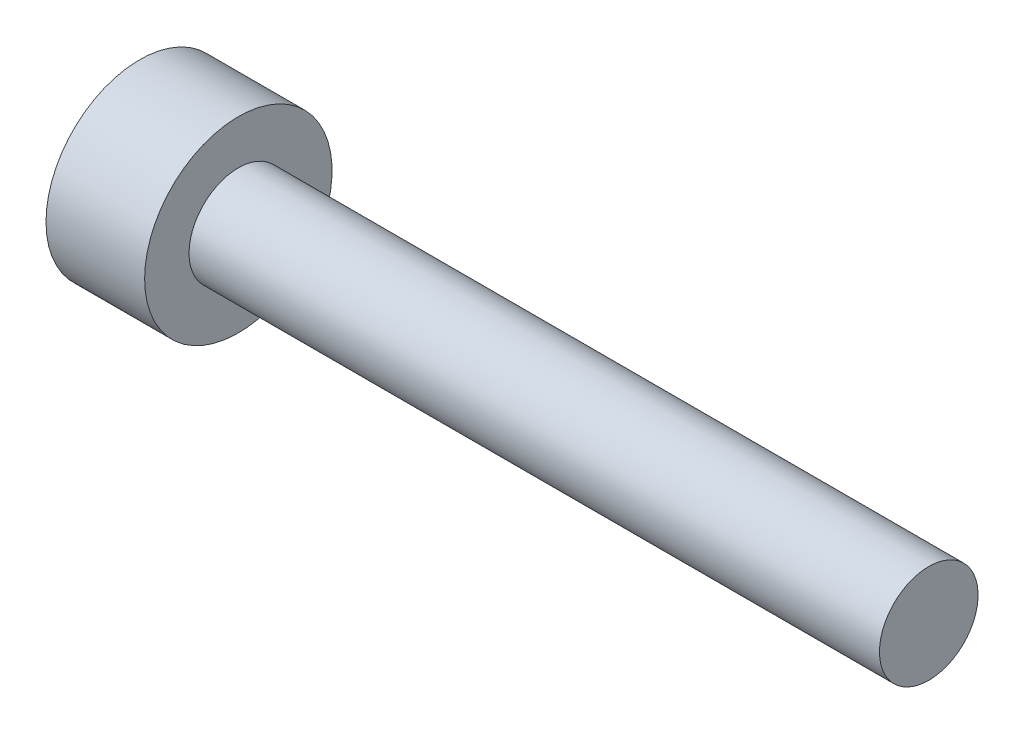
ISO-10303-21;
HEADER;
FILE_DESCRIPTION(('STEP AP214'),'2;1');
FILE_NAME('part.step','',(''),(''),'','','');
FILE_SCHEMA(('AUTOMOTIVE_DESIGN { 1 0 10303 214 1 1 1 1 }'));
ENDSEC;
DATA;
#1=APPLICATION_CONTEXT('core data for automotive mechanical design processes');
#2=APPLICATION_PROTOCOL_DEFINITION('international standard','automotive_design',2000,#1);
#3=PRODUCT_CONTEXT('',#1,'mechanical');
#4=PRODUCT('Part','Part','',(#3));
#5=PRODUCT_RELATED_PRODUCT_CATEGORY('part','',(#4));
#6=PRODUCT_DEFINITION_FORMATION('','',#4);
#7=PRODUCT_DEFINITION_CONTEXT('part definition',#1,'design');
#8=PRODUCT_DEFINITION('design','',#6,#7);
#9=PRODUCT_DEFINITION_SHAPE('','',#8);
#10=(LENGTH_UNIT() NAMED_UNIT(*) SI_UNIT(.MILLI.,.METRE.));
#11=(NAMED_UNIT(*) PLANE_ANGLE_UNIT() SI_UNIT($,.RADIAN.));
#12=(NAMED_UNIT(*) SI_UNIT($,.STERADIAN.) SOLID_ANGLE_UNIT());
#13=UNCERTAINTY_MEASURE_WITH_UNIT(LENGTH_MEASURE(1.E-05),#10,'distance_accuracy_value','');
#14=(GEOMETRIC_REPRESENTATION_CONTEXT(3) GLOBAL_UNCERTAINTY_ASSIGNED_CONTEXT((#13)) GLOBAL_UNIT_ASSIGNED_CONTEXT((#10,
#11,#12)) REPRESENTATION_CONTEXT('',''));
#15=CARTESIAN_POINT('',(0.,0.,0.));
#16=DIRECTION('',(0.,0.,1.));
#17=DIRECTION('',(1.,0.,0.));
#18=AXIS2_PLACEMENT_3D('',#15,#16,#17);
#19=CARTESIAN_POINT('',(-2.,0.,0.));
#20=DIRECTION('',(1.,0.,0.));
#21=DIRECTION('',(0.,0.,-1.));
#22=AXIS2_PLACEMENT_3D('',#19,#20,#21);
#23=PLANE('',#22);
#24=CARTESIAN_POINT('',(-2.,0.,0.));
#25=DIRECTION('',(-1.,0.,0.));
#26=DIRECTION('',(0.,0.,1.));
#27=AXIS2_PLACEMENT_3D('',#24,#25,#26);
#28=CIRCLE('',#27,1.9);
#29=CARTESIAN_POINT('',(-2.,0.,1.9));
#30=VERTEX_POINT('',#29);
#31=EDGE_CURVE('E11',#30,#30,#28,.T.);
#32=ORIENTED_EDGE('',*,*,#31,.T.);
#33=EDGE_LOOP('',(#32));
#34=FACE_BOUND('',#33,.T.);
#35=DIRECTION('',(0.,0.866025403784439,-0.5));
#36=VECTOR('',#35,1.);
#37=CARTESIAN_POINT('',(-2.,-0.75,-0.433012701892219));
#38=LINE('',#37,#36);
#39=CARTESIAN_POINT('',(-2.,-0.75,-0.433012701892219));
#40=VERTEX_POINT('',#39);
#41=CARTESIAN_POINT('',(-2.,0.,-0.866025403784439));
#42=VERTEX_POINT('',#41);
#43=EDGE_CURVE('E54',#40,#42,#38,.T.);
#44=ORIENTED_EDGE('',*,*,#43,.T.);
#45=DIRECTION('',(0.,0.866025403784439,0.5));
#46=VECTOR('',#45,1.);
#47=CARTESIAN_POINT('',(-2.,0.,-0.866025403784439));
#48=LINE('',#47,#46);
#49=CARTESIAN_POINT('',(-2.,0.75,-0.433012701892219));
#50=VERTEX_POINT('',#49);
#51=EDGE_CURVE('E127',#42,#50,#48,.T.);
#52=ORIENTED_EDGE('',*,*,#51,.T.);
#53=DIRECTION('',(0.,0.,1.));
#54=VECTOR('',#53,1.);
#55=CARTESIAN_POINT('',(-2.,0.75,-0.433012701892219));
#56=LINE('',#55,#54);
#57=CARTESIAN_POINT('',(-2.,0.75,0.433012701892219));
#58=VERTEX_POINT('',#57);
#59=EDGE_CURVE('E129',#50,#58,#56,.T.);
#60=ORIENTED_EDGE('',*,*,#59,.T.);
#61=DIRECTION('',(0.,-0.866025403784438,0.5));
#62=VECTOR('',#61,1.);
#63=CARTESIAN_POINT('',(-2.,0.75,0.433012701892219));
#64=LINE('',#63,#62);
#65=CARTESIAN_POINT('',(-2.,0.,0.866025403784439));
#66=VERTEX_POINT('',#65);
#67=EDGE_CURVE('E135',#58,#66,#64,.T.);
#68=ORIENTED_EDGE('',*,*,#67,.T.);
#69=DIRECTION('',(0.,-0.866025403784439,-0.5));
#70=VECTOR('',#69,1.);
#71=CARTESIAN_POINT('',(-2.,0.,0.866025403784439));
#72=LINE('',#71,#70);
#73=CARTESIAN_POINT('',(-2.,-0.75,0.43301270189222));
#74=VERTEX_POINT('',#73);
#75=EDGE_CURVE('E116',#66,#74,#72,.T.);
#76=ORIENTED_EDGE('',*,*,#75,.T.);
#77=DIRECTION('',(0.,0.,-1.));
#78=VECTOR('',#77,1.);
#79=CARTESIAN_POINT('',(-2.,-0.75,0.43301270189222));
#80=LINE('',#79,#78);
#81=EDGE_CURVE('E134',#74,#40,#80,.T.);
#82=ORIENTED_EDGE('',*,*,#81,.T.);
#83=EDGE_LOOP('',(#44,#52,#60,#68,#76,#82));
#84=FACE_BOUND('',#83,.T.);
#85=ADVANCED_FACE('F41',(#34,#84),#23,.F.);
#86=CARTESIAN_POINT('',(-1000.,0.,0.));
#87=DIRECTION('',(-1.,0.,0.));
#88=DIRECTION('',(0.,0.,1.));
#89=AXIS2_PLACEMENT_3D('',#86,#87,#88);
#90=CYLINDRICAL_SURFACE('',#89,1.9);
#91=ORIENTED_EDGE('',*,*,#31,.F.);
#92=EDGE_LOOP('',(#91));
#93=FACE_BOUND('',#92,.T.);
#94=CARTESIAN_POINT('',(0.,0.,0.));
#95=DIRECTION('',(-1.,0.,0.));
#96=DIRECTION('',(0.,0.,1.));
#97=AXIS2_PLACEMENT_3D('',#94,#95,#96);
#98=CIRCLE('',#97,1.9);
#99=CARTESIAN_POINT('',(0.,0.,1.9));
#100=VERTEX_POINT('',#99);
#101=EDGE_CURVE('E48',#100,#100,#98,.T.);
#102=ORIENTED_EDGE('',*,*,#101,.T.);
#103=EDGE_LOOP('',(#102));
#104=FACE_BOUND('',#103,.T.);
#105=ADVANCED_FACE('F152',(#93,#104),#90,.T.);
#106=CARTESIAN_POINT('',(0.,1.9,0.));
#107=DIRECTION('',(-1.,0.,0.));
#108=DIRECTION('',(0.,0.,1.));
#109=AXIS2_PLACEMENT_3D('',#106,#107,#108);
#110=PLANE('',#109);
#111=ORIENTED_EDGE('',*,*,#101,.F.);
#112=EDGE_LOOP('',(#111));
#113=FACE_BOUND('',#112,.T.);
#114=CARTESIAN_POINT('',(0.,0.,0.));
#115=DIRECTION('',(-1.,0.,0.));
#116=DIRECTION('',(0.,0.,1.));
#117=AXIS2_PLACEMENT_3D('',#114,#115,#116);
#118=CIRCLE('',#117,1.);
#119=CARTESIAN_POINT('',(0.,0.,1.));
#120=VERTEX_POINT('',#119);
#121=EDGE_CURVE('E149',#120,#120,#118,.T.);
#122=ORIENTED_EDGE('',*,*,#121,.T.);
#123=EDGE_LOOP('',(#122));
#124=FACE_BOUND('',#123,.T.);
#125=ADVANCED_FACE('F156',(#113,#124),#110,.F.);
#126=CARTESIAN_POINT('',(-1000.,0.,0.));
#127=DIRECTION('',(-1.,0.,0.));
#128=DIRECTION('',(0.,0.,1.));
#129=AXIS2_PLACEMENT_3D('',#126,#127,#128);
#130=CYLINDRICAL_SURFACE('',#129,1.);
#131=ORIENTED_EDGE('',*,*,#121,.F.);
#132=EDGE_LOOP('',(#131));
#133=FACE_BOUND('',#132,.T.);
#134=CARTESIAN_POINT('',(14.,0.,0.));
#135=DIRECTION('',(-1.,0.,0.));
#136=DIRECTION('',(0.,0.,1.));
#137=AXIS2_PLACEMENT_3D('',#134,#135,#136);
#138=CIRCLE('',#137,1.);
#139=CARTESIAN_POINT('',(14.,0.,1.));
#140=VERTEX_POINT('',#139);
#141=EDGE_CURVE('E148',#140,#140,#138,.T.);
#142=ORIENTED_EDGE('',*,*,#141,.T.);
#143=EDGE_LOOP('',(#142));
#144=FACE_BOUND('',#143,.T.);
#145=ADVANCED_FACE('F157',(#133,#144),#130,.T.);
#146=CARTESIAN_POINT('',(14.,1.,0.));
#147=DIRECTION('',(-1.,0.,0.));
#148=DIRECTION('',(0.,0.,1.));
#149=AXIS2_PLACEMENT_3D('',#146,#147,#148);
#150=PLANE('',#149);
#151=ORIENTED_EDGE('',*,*,#141,.F.);
#152=EDGE_LOOP('',(#151));
#153=FACE_BOUND('',#152,.T.);
#154=ADVANCED_FACE('F164',(#153),#150,.F.);
#155=CARTESIAN_POINT('',(-1.,-0.75,-0.433012701892219));
#156=DIRECTION('',(0.,0.5,0.866025403784439));
#157=DIRECTION('',(0.,-0.866025403784439,0.5));
#158=AXIS2_PLACEMENT_3D('',#155,#156,#157);
#159=PLANE('',#158);
#160=ORIENTED_EDGE('',*,*,#43,.F.);
#161=DIRECTION('',(-1.,0.,0.));
#162=VECTOR('',#161,1.);
#163=CARTESIAN_POINT('',(-1.,-0.75,-0.433012701892219));
#164=LINE('',#163,#162);
#165=CARTESIAN_POINT('',(-1.,-0.75,-0.433012701892219));
#166=VERTEX_POINT('',#165);
#167=EDGE_CURVE('E121',#166,#40,#164,.T.);
#168=ORIENTED_EDGE('',*,*,#167,.F.);
#169=DIRECTION('',(0.,0.866025403784439,-0.5));
#170=VECTOR('',#169,1.);
#171=CARTESIAN_POINT('',(-1.,-0.75,-0.433012701892219));
#172=LINE('',#171,#170);
#173=CARTESIAN_POINT('',(-1.,0.,-0.866025403784439));
#174=VERTEX_POINT('',#173);
#175=EDGE_CURVE('E137',#166,#174,#172,.T.);
#176=ORIENTED_EDGE('',*,*,#175,.T.);
#177=DIRECTION('',(-1.,0.,0.));
#178=VECTOR('',#177,1.);
#179=CARTESIAN_POINT('',(-1.,0.,-0.866025403784439));
#180=LINE('',#179,#178);
#181=EDGE_CURVE('E145',#174,#42,#180,.T.);
#182=ORIENTED_EDGE('',*,*,#181,.T.);
#183=EDGE_LOOP('',(#160,#168,#176,#182));
#184=FACE_BOUND('',#183,.T.);
#185=ADVANCED_FACE('F168',(#184),#159,.T.);
#186=CARTESIAN_POINT('',(-1.,0.,-0.866025403784439));
#187=DIRECTION('',(0.,-0.5,0.866025403784439));
#188=DIRECTION('',(0.,-0.866025403784439,-0.5));
#189=AXIS2_PLACEMENT_3D('',#186,#187,#188);
#190=PLANE('',#189);
#191=ORIENTED_EDGE('',*,*,#51,.F.);
#192=ORIENTED_EDGE('',*,*,#181,.F.);
#193=DIRECTION('',(0.,0.866025403784439,0.5));
#194=VECTOR('',#193,1.);
#195=CARTESIAN_POINT('',(-1.,0.,-0.866025403784439));
#196=LINE('',#195,#194);
#197=CARTESIAN_POINT('',(-1.,0.75,-0.433012701892219));
#198=VERTEX_POINT('',#197);
#199=EDGE_CURVE('E94',#174,#198,#196,.T.);
#200=ORIENTED_EDGE('',*,*,#199,.T.);
#201=DIRECTION('',(-1.,0.,0.));
#202=VECTOR('',#201,1.);
#203=CARTESIAN_POINT('',(-1.,0.75,-0.433012701892219));
#204=LINE('',#203,#202);
#205=EDGE_CURVE('E142',#198,#50,#204,.T.);
#206=ORIENTED_EDGE('',*,*,#205,.T.);
#207=EDGE_LOOP('',(#191,#192,#200,#206));
#208=FACE_BOUND('',#207,.T.);
#209=ADVANCED_FACE('F176',(#208),#190,.T.);
#210=CARTESIAN_POINT('',(-1.,0.75,-0.433012701892219));
#211=DIRECTION('',(0.,-1.,0.));
#212=DIRECTION('',(0.,0.,-1.));
#213=AXIS2_PLACEMENT_3D('',#210,#211,#212);
#214=PLANE('',#213);
#215=ORIENTED_EDGE('',*,*,#59,.F.);
#216=ORIENTED_EDGE('',*,*,#205,.F.);
#217=DIRECTION('',(0.,0.,1.));
#218=VECTOR('',#217,1.);
#219=CARTESIAN_POINT('',(-1.,0.75,-0.433012701892219));
#220=LINE('',#219,#218);
#221=CARTESIAN_POINT('',(-1.,0.75,0.433012701892219));
#222=VERTEX_POINT('',#221);
#223=EDGE_CURVE('E115',#198,#222,#220,.T.);
#224=ORIENTED_EDGE('',*,*,#223,.T.);
#225=DIRECTION('',(-1.,0.,0.));
#226=VECTOR('',#225,1.);
#227=CARTESIAN_POINT('',(-1.,0.75,0.433012701892219));
#228=LINE('',#227,#226);
#229=EDGE_CURVE('E108',#222,#58,#228,.T.);
#230=ORIENTED_EDGE('',*,*,#229,.T.);
#231=EDGE_LOOP('',(#215,#216,#224,#230));
#232=FACE_BOUND('',#231,.T.);
#233=ADVANCED_FACE('F195',(#232),#214,.T.);
#234=CARTESIAN_POINT('',(-1.,0.75,0.433012701892219));
#235=DIRECTION('',(0.,-0.5,-0.866025403784439));
#236=DIRECTION('',(0.,0.866025403784438,-0.5));
#237=AXIS2_PLACEMENT_3D('',#234,#235,#236);
#238=PLANE('',#237);
#239=ORIENTED_EDGE('',*,*,#67,.F.);
#240=ORIENTED_EDGE('',*,*,#229,.F.);
#241=DIRECTION('',(0.,-0.866025403784438,0.5));
#242=VECTOR('',#241,1.);
#243=CARTESIAN_POINT('',(-1.,0.75,0.433012701892219));
#244=LINE('',#243,#242);
#245=CARTESIAN_POINT('',(-1.,0.,0.866025403784439));
#246=VERTEX_POINT('',#245);
#247=EDGE_CURVE('E102',#222,#246,#244,.T.);
#248=ORIENTED_EDGE('',*,*,#247,.T.);
#249=DIRECTION('',(-1.,0.,0.));
#250=VECTOR('',#249,1.);
#251=CARTESIAN_POINT('',(-1.,0.,0.866025403784439));
#252=LINE('',#251,#250);
#253=EDGE_CURVE('E107',#246,#66,#252,.T.);
#254=ORIENTED_EDGE('',*,*,#253,.T.);
#255=EDGE_LOOP('',(#239,#240,#248,#254));
#256=FACE_BOUND('',#255,.T.);
#257=ADVANCED_FACE('F110',(#256),#238,.T.);
#258=CARTESIAN_POINT('',(-1.,0.,0.866025403784439));
#259=DIRECTION('',(0.,0.5,-0.866025403784439));
#260=DIRECTION('',(0.,0.866025403784439,0.5));
#261=AXIS2_PLACEMENT_3D('',#258,#259,#260);
#262=PLANE('',#261);
#263=ORIENTED_EDGE('',*,*,#75,.F.);
#264=ORIENTED_EDGE('',*,*,#253,.F.);
#265=DIRECTION('',(0.,-0.866025403784439,-0.5));
#266=VECTOR('',#265,1.);
#267=CARTESIAN_POINT('',(-1.,0.,0.866025403784439));
#268=LINE('',#267,#266);
#269=CARTESIAN_POINT('',(-1.,-0.75,0.43301270189222));
#270=VERTEX_POINT('',#269);
#271=EDGE_CURVE('E112',#246,#270,#268,.T.);
#272=ORIENTED_EDGE('',*,*,#271,.T.);
#273=DIRECTION('',(-1.,0.,0.));
#274=VECTOR('',#273,1.);
#275=CARTESIAN_POINT('',(-1.,-0.75,0.43301270189222));
#276=LINE('',#275,#274);
#277=EDGE_CURVE('E84',#270,#74,#276,.T.);
#278=ORIENTED_EDGE('',*,*,#277,.T.);
#279=EDGE_LOOP('',(#263,#264,#272,#278));
#280=FACE_BOUND('',#279,.T.);
#281=ADVANCED_FACE('F111',(#280),#262,.T.);
#282=CARTESIAN_POINT('',(-1.,-0.75,0.43301270189222));
#283=DIRECTION('',(0.,1.,0.));
#284=DIRECTION('',(0.,0.,1.));
#285=AXIS2_PLACEMENT_3D('',#282,#283,#284);
#286=PLANE('',#285);
#287=ORIENTED_EDGE('',*,*,#81,.F.);
#288=ORIENTED_EDGE('',*,*,#277,.F.);
#289=DIRECTION('',(0.,0.,-1.));
#290=VECTOR('',#289,1.);
#291=CARTESIAN_POINT('',(-1.,-0.75,0.43301270189222));
#292=LINE('',#291,#290);
#293=EDGE_CURVE('E62',#270,#166,#292,.T.);
#294=ORIENTED_EDGE('',*,*,#293,.T.);
#295=ORIENTED_EDGE('',*,*,#167,.T.);
#296=EDGE_LOOP('',(#287,#288,#294,#295));
#297=FACE_BOUND('',#296,.T.);
#298=ADVANCED_FACE('F183',(#297),#286,.T.);
#299=CARTESIAN_POINT('',(-1.,0.,0.));
#300=DIRECTION('',(1.,0.,0.));
#301=DIRECTION('',(0.,0.,-1.));
#302=AXIS2_PLACEMENT_3D('',#299,#300,#301);
#303=PLANE('',#302);
#304=ORIENTED_EDGE('',*,*,#175,.F.);
#305=ORIENTED_EDGE('',*,*,#293,.F.);
#306=ORIENTED_EDGE('',*,*,#271,.F.);
#307=ORIENTED_EDGE('',*,*,#247,.F.);
#308=ORIENTED_EDGE('',*,*,#223,.F.);
#309=ORIENTED_EDGE('',*,*,#199,.F.);
#310=EDGE_LOOP('',(#304,#305,#306,#307,#308,#309));
#311=FACE_BOUND('',#310,.T.);
#312=ADVANCED_FACE('F118',(#311),#303,.F.);
#313=CLOSED_SHELL('',(#85,#105,#125,#145,#154,#185,#209,#233,#257,#281,#298,#312));
#314=MANIFOLD_SOLID_BREP('B2',#313);
#315=ADVANCED_BREP_SHAPE_REPRESENTATION('',(#18,#314),#14);
#316=SHAPE_DEFINITION_REPRESENTATION(#9,#315);
ENDSEC;
END-ISO-10303-21;
